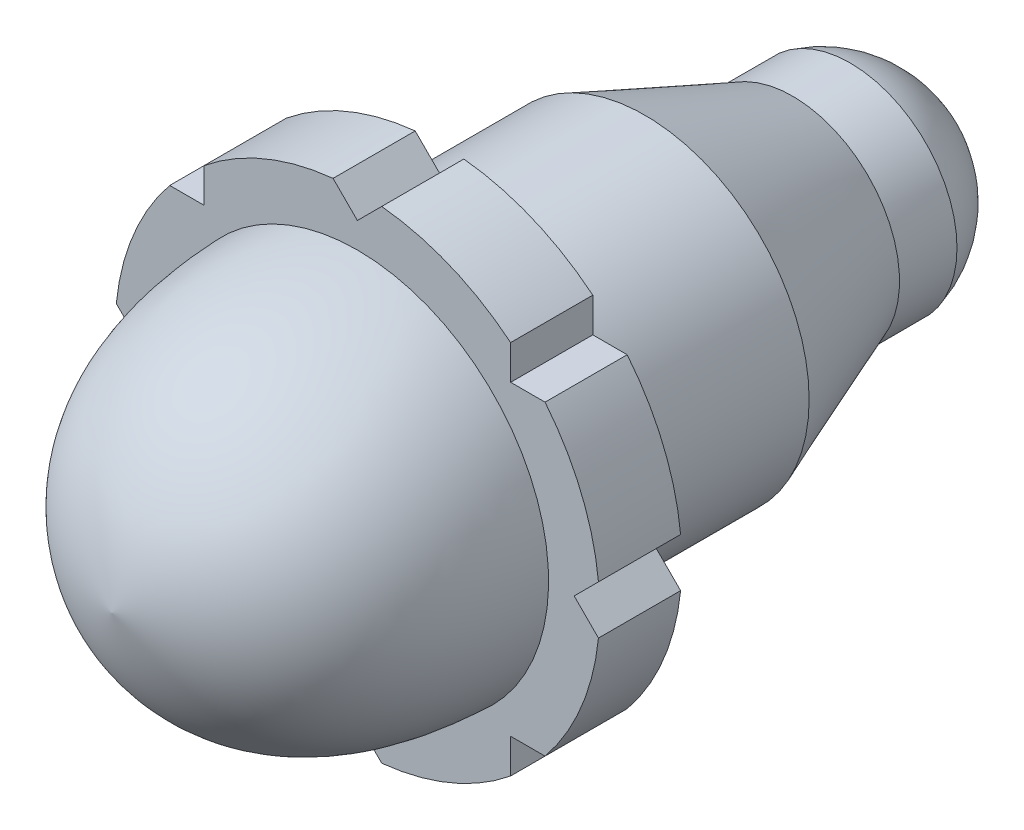
ISO-10303-21;
HEADER;
FILE_DESCRIPTION(('STEP AP214'),'2;1');
FILE_NAME('part.step','',(''),(''),'','','');
FILE_SCHEMA(('AUTOMOTIVE_DESIGN { 1 0 10303 214 1 1 1 1 }'));
ENDSEC;
DATA;
#1=APPLICATION_CONTEXT('core data for automotive mechanical design processes');
#2=APPLICATION_PROTOCOL_DEFINITION('international standard','automotive_design',2000,#1);
#3=PRODUCT_CONTEXT('',#1,'mechanical');
#4=PRODUCT('Part','Part','',(#3));
#5=PRODUCT_RELATED_PRODUCT_CATEGORY('part','',(#4));
#6=PRODUCT_DEFINITION_FORMATION('','',#4);
#7=PRODUCT_DEFINITION_CONTEXT('part definition',#1,'design');
#8=PRODUCT_DEFINITION('design','',#6,#7);
#9=PRODUCT_DEFINITION_SHAPE('','',#8);
#10=(LENGTH_UNIT() NAMED_UNIT(*) SI_UNIT(.MILLI.,.METRE.));
#11=(NAMED_UNIT(*) PLANE_ANGLE_UNIT() SI_UNIT($,.RADIAN.));
#12=(NAMED_UNIT(*) SI_UNIT($,.STERADIAN.) SOLID_ANGLE_UNIT());
#13=UNCERTAINTY_MEASURE_WITH_UNIT(LENGTH_MEASURE(1.E-05),#10,'distance_accuracy_value','');
#14=(GEOMETRIC_REPRESENTATION_CONTEXT(3) GLOBAL_UNCERTAINTY_ASSIGNED_CONTEXT((#13)) GLOBAL_UNIT_ASSIGNED_CONTEXT((#10,
#11,#12)) REPRESENTATION_CONTEXT('',''));
#15=CARTESIAN_POINT('',(0.,0.,0.));
#16=DIRECTION('',(0.,0.,1.));
#17=DIRECTION('',(1.,0.,0.));
#18=AXIS2_PLACEMENT_3D('',#15,#16,#17);
#19=CARTESIAN_POINT('',(0.,0.,12.712464268813));
#20=DIRECTION('',(0.,0.,1.));
#21=DIRECTION('',(1.,0.,0.));
#22=AXIS2_PLACEMENT_3D('',#19,#20,#21);
#23=CYLINDRICAL_SURFACE('',#22,7.493);
#24=CARTESIAN_POINT('',(0.,0.,0.));
#25=DIRECTION('',(0.,0.,1.));
#26=DIRECTION('',(1.,0.,0.));
#27=AXIS2_PLACEMENT_3D('',#24,#25,#26);
#28=CIRCLE('',#27,7.493);
#29=CARTESIAN_POINT('',(-7.45515396115093,-0.752149197656661,0.));
#30=VERTEX_POINT('',#29);
#31=CARTESIAN_POINT('',(-5.80343971884658,-4.73974012259258,0.));
#32=VERTEX_POINT('',#31);
#33=EDGE_CURVE('E466',#30,#32,#28,.T.);
#34=ORIENTED_EDGE('',*,*,#33,.F.);
#35=DIRECTION('',(0.,0.,1.));
#36=VECTOR('',#35,1.);
#37=CARTESIAN_POINT('',(-7.45515396115093,-0.752149197656661,-17.78));
#38=LINE('',#37,#36);
#39=CARTESIAN_POINT('',(-7.45515396115093,-0.752149197656661,-2.54));
#40=VERTEX_POINT('',#39);
#41=EDGE_CURVE('E283',#40,#30,#38,.T.);
#42=ORIENTED_EDGE('',*,*,#41,.F.);
#43=CARTESIAN_POINT('',(0.,0.,-2.54));
#44=DIRECTION('',(0.,0.,1.));
#45=DIRECTION('',(1.,0.,0.));
#46=AXIS2_PLACEMENT_3D('',#43,#44,#45);
#47=CIRCLE('',#46,7.493);
#48=CARTESIAN_POINT('',(-5.80343971884658,-4.73974012259258,-2.54));
#49=VERTEX_POINT('',#48);
#50=EDGE_CURVE('E525',#40,#49,#47,.T.);
#51=ORIENTED_EDGE('',*,*,#50,.T.);
#52=DIRECTION('',(0.,0.,1.));
#53=VECTOR('',#52,1.);
#54=CARTESIAN_POINT('',(-5.80343971884658,-4.73974012259258,-17.78));
#55=LINE('',#54,#53);
#56=EDGE_CURVE('E302',#49,#32,#55,.T.);
#57=ORIENTED_EDGE('',*,*,#56,.T.);
#58=EDGE_LOOP('',(#34,#42,#51,#57));
#59=FACE_BOUND('',#58,.T.);
#60=ADVANCED_FACE('F43',(#59),#23,.T.);
#61=CARTESIAN_POINT('',(-4.73974012259252,-5.80343971884663,0.));
#62=VERTEX_POINT('',#61);
#63=CARTESIAN_POINT('',(-0.752149197656635,-7.45515396115093,0.));
#64=VERTEX_POINT('',#63);
#65=EDGE_CURVE('E473',#62,#64,#28,.T.);
#66=ORIENTED_EDGE('',*,*,#65,.F.);
#67=DIRECTION('',(0.,0.,1.));
#68=VECTOR('',#67,1.);
#69=CARTESIAN_POINT('',(-4.73974012259252,-5.80343971884663,-17.78));
#70=LINE('',#69,#68);
#71=CARTESIAN_POINT('',(-4.73974012259252,-5.80343971884663,-2.54));
#72=VERTEX_POINT('',#71);
#73=EDGE_CURVE('E310',#72,#62,#70,.T.);
#74=ORIENTED_EDGE('',*,*,#73,.F.);
#75=CARTESIAN_POINT('',(-0.752149197656636,-7.45515396115093,-2.54));
#76=VERTEX_POINT('',#75);
#77=EDGE_CURVE('E530',#72,#76,#47,.T.);
#78=ORIENTED_EDGE('',*,*,#77,.T.);
#79=DIRECTION('',(0.,0.,1.));
#80=VECTOR('',#79,1.);
#81=CARTESIAN_POINT('',(-0.752149197656635,-7.45515396115093,-17.78));
#82=LINE('',#81,#80);
#83=EDGE_CURVE('E327',#76,#64,#82,.T.);
#84=ORIENTED_EDGE('',*,*,#83,.T.);
#85=EDGE_LOOP('',(#66,#74,#78,#84));
#86=FACE_BOUND('',#85,.T.);
#87=ADVANCED_FACE('F455',(#86),#23,.T.);
#88=CARTESIAN_POINT('',(0.752149197656635,-7.45515396115093,0.));
#89=VERTEX_POINT('',#88);
#90=CARTESIAN_POINT('',(4.7397401225926,-5.80343971884656,0.));
#91=VERTEX_POINT('',#90);
#92=EDGE_CURVE('E480',#89,#91,#28,.T.);
#93=ORIENTED_EDGE('',*,*,#92,.F.);
#94=DIRECTION('',(0.,0.,1.));
#95=VECTOR('',#94,1.);
#96=CARTESIAN_POINT('',(0.752149197656635,-7.45515396115093,-17.78));
#97=LINE('',#96,#95);
#98=CARTESIAN_POINT('',(0.752149197656635,-7.45515396115093,-2.54));
#99=VERTEX_POINT('',#98);
#100=EDGE_CURVE('E335',#99,#89,#97,.T.);
#101=ORIENTED_EDGE('',*,*,#100,.F.);
#102=CARTESIAN_POINT('',(4.7397401225926,-5.80343971884656,-2.54));
#103=VERTEX_POINT('',#102);
#104=EDGE_CURVE('E533',#99,#103,#47,.T.);
#105=ORIENTED_EDGE('',*,*,#104,.T.);
#106=DIRECTION('',(0.,0.,1.));
#107=VECTOR('',#106,1.);
#108=CARTESIAN_POINT('',(4.7397401225926,-5.80343971884656,-17.78));
#109=LINE('',#108,#107);
#110=EDGE_CURVE('E350',#103,#91,#109,.T.);
#111=ORIENTED_EDGE('',*,*,#110,.T.);
#112=EDGE_LOOP('',(#93,#101,#105,#111));
#113=FACE_BOUND('',#112,.T.);
#114=ADVANCED_FACE('F461',(#113),#23,.T.);
#115=CARTESIAN_POINT('',(5.80343971884665,-4.7397401225925,0.));
#116=VERTEX_POINT('',#115);
#117=CARTESIAN_POINT('',(7.45515396115094,-0.752149197656557,0.));
#118=VERTEX_POINT('',#117);
#119=EDGE_CURVE('E233',#116,#118,#28,.T.);
#120=ORIENTED_EDGE('',*,*,#119,.F.);
#121=DIRECTION('',(0.,0.,1.));
#122=VECTOR('',#121,1.);
#123=CARTESIAN_POINT('',(5.80343971884665,-4.7397401225925,-17.78));
#124=LINE('',#123,#122);
#125=CARTESIAN_POINT('',(5.80343971884665,-4.7397401225925,-2.54));
#126=VERTEX_POINT('',#125);
#127=EDGE_CURVE('E358',#126,#116,#124,.T.);
#128=ORIENTED_EDGE('',*,*,#127,.F.);
#129=CARTESIAN_POINT('',(7.45515396115094,-0.752149197656557,-2.54));
#130=VERTEX_POINT('',#129);
#131=EDGE_CURVE('E516',#126,#130,#47,.T.);
#132=ORIENTED_EDGE('',*,*,#131,.T.);
#133=DIRECTION('',(0.,0.,1.));
#134=VECTOR('',#133,1.);
#135=CARTESIAN_POINT('',(7.45515396115094,-0.752149197656557,-17.78));
#136=LINE('',#135,#134);
#137=EDGE_CURVE('E67',#130,#118,#136,.T.);
#138=ORIENTED_EDGE('',*,*,#137,.T.);
#139=EDGE_LOOP('',(#120,#128,#132,#138));
#140=FACE_BOUND('',#139,.T.);
#141=ADVANCED_FACE('F546',(#140),#23,.T.);
#142=CARTESIAN_POINT('',(7.45515396115093,0.752149197656713,0.));
#143=VERTEX_POINT('',#142);
#144=CARTESIAN_POINT('',(5.80343971884654,4.73974012259262,0.));
#145=VERTEX_POINT('',#144);
#146=EDGE_CURVE('E523',#143,#145,#28,.T.);
#147=ORIENTED_EDGE('',*,*,#146,.F.);
#148=DIRECTION('',(0.,0.,1.));
#149=VECTOR('',#148,1.);
#150=CARTESIAN_POINT('',(7.45515396115093,0.752149197656713,-17.78));
#151=LINE('',#150,#149);
#152=CARTESIAN_POINT('',(7.45515396115093,0.752149197656713,-2.54));
#153=VERTEX_POINT('',#152);
#154=EDGE_CURVE('E221',#153,#143,#151,.T.);
#155=ORIENTED_EDGE('',*,*,#154,.F.);
#156=CARTESIAN_POINT('',(5.80343971884655,4.73974012259262,-2.54));
#157=VERTEX_POINT('',#156);
#158=EDGE_CURVE('E511',#153,#157,#47,.T.);
#159=ORIENTED_EDGE('',*,*,#158,.T.);
#160=DIRECTION('',(0.,0.,1.));
#161=VECTOR('',#160,1.);
#162=CARTESIAN_POINT('',(5.80343971884654,4.73974012259262,-17.78));
#163=LINE('',#162,#161);
#164=EDGE_CURVE('E59',#157,#145,#163,.T.);
#165=ORIENTED_EDGE('',*,*,#164,.T.);
#166=EDGE_LOOP('',(#147,#155,#159,#165));
#167=FACE_BOUND('',#166,.T.);
#168=ADVANCED_FACE('F549',(#167),#23,.T.);
#169=CARTESIAN_POINT('',(4.73974012259248,5.80343971884666,0.));
#170=VERTEX_POINT('',#169);
#171=CARTESIAN_POINT('',(0.752149197656635,7.45515396115093,0.));
#172=VERTEX_POINT('',#171);
#173=EDGE_CURVE('E485',#170,#172,#28,.T.);
#174=ORIENTED_EDGE('',*,*,#173,.F.);
#175=DIRECTION('',(0.,0.,1.));
#176=VECTOR('',#175,1.);
#177=CARTESIAN_POINT('',(4.73974012259248,5.80343971884666,-17.78));
#178=LINE('',#177,#176);
#179=CARTESIAN_POINT('',(4.73974012259248,5.80343971884666,-2.54));
#180=VERTEX_POINT('',#179);
#181=EDGE_CURVE('E262',#180,#170,#178,.T.);
#182=ORIENTED_EDGE('',*,*,#181,.F.);
#183=CARTESIAN_POINT('',(0.752149197656636,7.45515396115093,-2.54));
#184=VERTEX_POINT('',#183);
#185=EDGE_CURVE('E493',#180,#184,#47,.T.);
#186=ORIENTED_EDGE('',*,*,#185,.T.);
#187=DIRECTION('',(0.,0.,1.));
#188=VECTOR('',#187,1.);
#189=CARTESIAN_POINT('',(0.752149197656635,7.45515396115093,-17.78));
#190=LINE('',#189,#188);
#191=EDGE_CURVE('E405',#184,#172,#190,.T.);
#192=ORIENTED_EDGE('',*,*,#191,.T.);
#193=EDGE_LOOP('',(#174,#182,#186,#192));
#194=FACE_BOUND('',#193,.T.);
#195=ADVANCED_FACE('F508',(#194),#23,.T.);
#196=CARTESIAN_POINT('',(-5.80343971884661,4.73974012259254,-2.54));
#197=VERTEX_POINT('',#196);
#198=CARTESIAN_POINT('',(-7.45515396115094,0.752149197656609,-2.54));
#199=VERTEX_POINT('',#198);
#200=EDGE_CURVE('E520',#197,#199,#47,.T.);
#201=ORIENTED_EDGE('',*,*,#200,.T.);
#202=DIRECTION('',(0.,0.,1.));
#203=VECTOR('',#202,1.);
#204=CARTESIAN_POINT('',(-7.45515396115094,0.752149197656609,-17.78));
#205=LINE('',#204,#203);
#206=CARTESIAN_POINT('',(-7.45515396115094,0.752149197656609,0.));
#207=VERTEX_POINT('',#206);
#208=EDGE_CURVE('E275',#199,#207,#205,.T.);
#209=ORIENTED_EDGE('',*,*,#208,.T.);
#210=CARTESIAN_POINT('',(-5.80343971884661,4.73974012259254,0.));
#211=VERTEX_POINT('',#210);
#212=EDGE_CURVE('E472',#211,#207,#28,.T.);
#213=ORIENTED_EDGE('',*,*,#212,.F.);
#214=DIRECTION('',(0.,0.,1.));
#215=VECTOR('',#214,1.);
#216=CARTESIAN_POINT('',(-5.80343971884661,4.73974012259254,-17.78));
#217=LINE('',#216,#215);
#218=EDGE_CURVE('E381',#197,#211,#217,.T.);
#219=ORIENTED_EDGE('',*,*,#218,.F.);
#220=EDGE_LOOP('',(#201,#209,#213,#219));
#221=FACE_BOUND('',#220,.T.);
#222=ADVANCED_FACE('F440',(#221),#23,.T.);
#223=CARTESIAN_POINT('',(0.,0.,12.712464268813));
#224=DIRECTION('',(0.,0.,1.));
#225=DIRECTION('',(1.,0.,0.));
#226=AXIS2_PLACEMENT_3D('',#223,#224,#225);
#227=CYLINDRICAL_SURFACE('',#226,5.08);
#228=CARTESIAN_POINT('',(0.,0.,-2.54));
#229=DIRECTION('',(0.,0.,1.));
#230=DIRECTION('',(1.,0.,0.));
#231=AXIS2_PLACEMENT_3D('',#228,#229,#230);
#232=CIRCLE('',#231,5.08);
#233=CARTESIAN_POINT('',(5.08,0.,-2.54));
#234=VERTEX_POINT('',#233);
#235=EDGE_CURVE('E512',#234,#234,#232,.T.);
#236=ORIENTED_EDGE('',*,*,#235,.F.);
#237=EDGE_LOOP('',(#236));
#238=FACE_BOUND('',#237,.T.);
#239=CARTESIAN_POINT('',(0.,0.,-8.89));
#240=DIRECTION('',(0.,0.,-1.));
#241=DIRECTION('',(-1.,0.,0.));
#242=AXIS2_PLACEMENT_3D('',#239,#240,#241);
#243=CIRCLE('',#242,5.08);
#244=CARTESIAN_POINT('',(-5.08,0.,-8.89));
#245=VERTEX_POINT('',#244);
#246=EDGE_CURVE('E411',#245,#245,#243,.T.);
#247=ORIENTED_EDGE('',*,*,#246,.F.);
#248=EDGE_LOOP('',(#247));
#249=FACE_BOUND('',#248,.T.);
#250=ADVANCED_FACE('F437',(#238,#249),#227,.T.);
#251=CARTESIAN_POINT('',(0.,0.,0.));
#252=DIRECTION('',(0.,0.,-1.));
#253=DIRECTION('',(-1.,0.,0.));
#254=AXIS2_PLACEMENT_3D('',#251,#252,#253);
#255=PLANE('',#254);
#256=CARTESIAN_POINT('',(0.,0.,0.));
#257=DIRECTION('',(0.,0.,-1.));
#258=DIRECTION('',(-1.,0.,0.));
#259=AXIS2_PLACEMENT_3D('',#256,#257,#258);
#260=CIRCLE('',#259,5.9130095269886);
#261=CARTESIAN_POINT('',(-5.9130095269886,0.,0.));
#262=VERTEX_POINT('',#261);
#263=EDGE_CURVE('E419',#262,#262,#260,.T.);
#264=ORIENTED_EDGE('',*,*,#263,.T.);
#265=EDGE_LOOP('',(#264));
#266=FACE_BOUND('',#265,.T.);
#267=DIRECTION('',(-0.707106781186549,0.707106781186546,0.));
#268=VECTOR('',#267,1.);
#269=CARTESIAN_POINT('',(-6.7030047634943,0.,0.));
#270=LINE('',#269,#268);
#271=CARTESIAN_POINT('',(-6.7030047634943,0.,0.));
#272=VERTEX_POINT('',#271);
#273=EDGE_CURVE('E268',#272,#207,#270,.T.);
#274=ORIENTED_EDGE('',*,*,#273,.F.);
#275=DIRECTION('',(0.707106781186544,0.707106781186551,0.));
#276=VECTOR('',#275,1.);
#277=CARTESIAN_POINT('',(-6.7030047634943,0.,0.));
#278=LINE('',#277,#276);
#279=EDGE_CURVE('E286',#30,#272,#278,.T.);
#280=ORIENTED_EDGE('',*,*,#279,.F.);
#281=ORIENTED_EDGE('',*,*,#33,.T.);
#282=DIRECTION('',(-1.,0.,0.));
#283=VECTOR('',#282,1.);
#284=CARTESIAN_POINT('',(-4.73974012259253,-4.73974012259258,0.));
#285=LINE('',#284,#283);
#286=CARTESIAN_POINT('',(-4.73974012259253,-4.73974012259258,0.));
#287=VERTEX_POINT('',#286);
#288=EDGE_CURVE('E295',#287,#32,#285,.T.);
#289=ORIENTED_EDGE('',*,*,#288,.F.);
#290=DIRECTION('',(0.,1.,0.));
#291=VECTOR('',#290,1.);
#292=CARTESIAN_POINT('',(-4.73974012259253,-4.73974012259258,0.));
#293=LINE('',#292,#291);
#294=EDGE_CURVE('E313',#62,#287,#293,.T.);
#295=ORIENTED_EDGE('',*,*,#294,.F.);
#296=ORIENTED_EDGE('',*,*,#65,.T.);
#297=DIRECTION('',(-0.707106781186548,-0.707106781186547,0.));
#298=VECTOR('',#297,1.);
#299=CARTESIAN_POINT('',(0.,-6.7030047634943,0.));
#300=LINE('',#299,#298);
#301=CARTESIAN_POINT('',(0.,-6.7030047634943,0.));
#302=VERTEX_POINT('',#301);
#303=EDGE_CURVE('E320',#302,#64,#300,.T.);
#304=ORIENTED_EDGE('',*,*,#303,.F.);
#305=DIRECTION('',(-0.707106781186548,0.707106781186547,0.));
#306=VECTOR('',#305,1.);
#307=CARTESIAN_POINT('',(0.,-6.7030047634943,0.));
#308=LINE('',#307,#306);
#309=EDGE_CURVE('E338',#89,#302,#308,.T.);
#310=ORIENTED_EDGE('',*,*,#309,.F.);
#311=ORIENTED_EDGE('',*,*,#92,.T.);
#312=DIRECTION('',(0.,-1.,0.));
#313=VECTOR('',#312,1.);
#314=CARTESIAN_POINT('',(4.73974012259259,-4.73974012259251,0.));
#315=LINE('',#314,#313);
#316=CARTESIAN_POINT('',(4.73974012259259,-4.73974012259251,0.));
#317=VERTEX_POINT('',#316);
#318=EDGE_CURVE('E250',#317,#91,#315,.T.);
#319=ORIENTED_EDGE('',*,*,#318,.F.);
#320=DIRECTION('',(-1.,0.,0.));
#321=VECTOR('',#320,1.);
#322=CARTESIAN_POINT('',(4.73974012259259,-4.73974012259251,0.));
#323=LINE('',#322,#321);
#324=EDGE_CURVE('E361',#116,#317,#323,.T.);
#325=ORIENTED_EDGE('',*,*,#324,.F.);
#326=ORIENTED_EDGE('',*,*,#119,.T.);
#327=DIRECTION('',(0.707106781186554,-0.707106781186541,0.));
#328=VECTOR('',#327,1.);
#329=CARTESIAN_POINT('',(6.7030047634943,0.,0.));
#330=LINE('',#329,#328);
#331=CARTESIAN_POINT('',(6.7030047634943,0.,0.));
#332=VERTEX_POINT('',#331);
#333=EDGE_CURVE('E211',#332,#118,#330,.T.);
#334=ORIENTED_EDGE('',*,*,#333,.F.);
#335=DIRECTION('',(-0.707106781186539,-0.707106781186556,0.));
#336=VECTOR('',#335,1.);
#337=CARTESIAN_POINT('',(6.7030047634943,0.,0.));
#338=LINE('',#337,#336);
#339=EDGE_CURVE('E218',#143,#332,#338,.T.);
#340=ORIENTED_EDGE('',*,*,#339,.F.);
#341=ORIENTED_EDGE('',*,*,#146,.T.);
#342=DIRECTION('',(1.,0.,0.));
#343=VECTOR('',#342,1.);
#344=CARTESIAN_POINT('',(4.73974012259249,4.73974012259261,0.));
#345=LINE('',#344,#343);
#346=CARTESIAN_POINT('',(4.73974012259249,4.73974012259261,0.));
#347=VERTEX_POINT('',#346);
#348=EDGE_CURVE('E251',#347,#145,#345,.T.);
#349=ORIENTED_EDGE('',*,*,#348,.F.);
#350=DIRECTION('',(0.,-1.,0.));
#351=VECTOR('',#350,1.);
#352=CARTESIAN_POINT('',(4.73974012259249,4.73974012259261,0.));
#353=LINE('',#352,#351);
#354=EDGE_CURVE('E239',#170,#347,#353,.T.);
#355=ORIENTED_EDGE('',*,*,#354,.F.);
#356=ORIENTED_EDGE('',*,*,#173,.T.);
#357=DIRECTION('',(0.707106781186548,0.707106781186547,0.));
#358=VECTOR('',#357,1.);
#359=CARTESIAN_POINT('',(0.,6.7030047634943,0.));
#360=LINE('',#359,#358);
#361=CARTESIAN_POINT('',(0.,6.7030047634943,0.));
#362=VERTEX_POINT('',#361);
#363=EDGE_CURVE('E396',#362,#172,#360,.T.);
#364=ORIENTED_EDGE('',*,*,#363,.F.);
#365=DIRECTION('',(0.707106781186548,-0.707106781186547,0.));
#366=VECTOR('',#365,1.);
#367=CARTESIAN_POINT('',(0.,6.7030047634943,0.));
#368=LINE('',#367,#366);
#369=CARTESIAN_POINT('',(-0.752149197656635,7.45515396115093,0.));
#370=VERTEX_POINT('',#369);
#371=EDGE_CURVE('E392',#370,#362,#368,.T.);
#372=ORIENTED_EDGE('',*,*,#371,.F.);
#373=CARTESIAN_POINT('',(-4.73974012259256,5.8034397188466,0.));
#374=VERTEX_POINT('',#373);
#375=EDGE_CURVE('E478',#370,#374,#28,.T.);
#376=ORIENTED_EDGE('',*,*,#375,.T.);
#377=DIRECTION('',(0.,1.,0.));
#378=VECTOR('',#377,1.);
#379=CARTESIAN_POINT('',(-4.73974012259256,4.73974012259254,0.));
#380=LINE('',#379,#378);
#381=CARTESIAN_POINT('',(-4.73974012259256,4.73974012259254,0.));
#382=VERTEX_POINT('',#381);
#383=EDGE_CURVE('E294',#382,#374,#380,.T.);
#384=ORIENTED_EDGE('',*,*,#383,.F.);
#385=DIRECTION('',(1.,0.,0.));
#386=VECTOR('',#385,1.);
#387=CARTESIAN_POINT('',(-4.73974012259256,4.73974012259254,0.));
#388=LINE('',#387,#386);
#389=EDGE_CURVE('E384',#211,#382,#388,.T.);
#390=ORIENTED_EDGE('',*,*,#389,.F.);
#391=ORIENTED_EDGE('',*,*,#212,.T.);
#392=EDGE_LOOP('',(#274,#280,#281,#289,#295,#296,#304,#310,#311,#319,#325,#326,#334,#340,#341,
#349,#355,#356,#364,#372,#376,#384,#390,#391));
#393=FACE_BOUND('',#392,.T.);
#394=ADVANCED_FACE('F230',(#266,#393),#255,.F.);
#395=CARTESIAN_POINT('',(-0.752149197656635,7.45515396115093,-2.54));
#396=VERTEX_POINT('',#395);
#397=CARTESIAN_POINT('',(-4.73974012259256,5.8034397188466,-2.54));
#398=VERTEX_POINT('',#397);
#399=EDGE_CURVE('E486',#396,#398,#47,.T.);
#400=ORIENTED_EDGE('',*,*,#399,.T.);
#401=DIRECTION('',(0.,0.,1.));
#402=VECTOR('',#401,1.);
#403=CARTESIAN_POINT('',(-4.73974012259256,5.8034397188466,-17.78));
#404=LINE('',#403,#402);
#405=EDGE_CURVE('E373',#398,#374,#404,.T.);
#406=ORIENTED_EDGE('',*,*,#405,.T.);
#407=ORIENTED_EDGE('',*,*,#375,.F.);
#408=DIRECTION('',(0.,0.,1.));
#409=VECTOR('',#408,1.);
#410=CARTESIAN_POINT('',(-0.752149197656635,7.45515396115093,-17.78));
#411=LINE('',#410,#409);
#412=EDGE_CURVE('E401',#396,#370,#411,.T.);
#413=ORIENTED_EDGE('',*,*,#412,.F.);
#414=EDGE_LOOP('',(#400,#406,#407,#413));
#415=FACE_BOUND('',#414,.T.);
#416=ADVANCED_FACE('F444',(#415),#23,.T.);
#417=CARTESIAN_POINT('',(0.,7.493,-2.54));
#418=DIRECTION('',(0.,0.,1.));
#419=DIRECTION('',(1.,0.,0.));
#420=AXIS2_PLACEMENT_3D('',#417,#418,#419);
#421=PLANE('',#420);
#422=ORIENTED_EDGE('',*,*,#50,.F.);
#423=DIRECTION('',(0.707106781186544,0.707106781186551,0.));
#424=VECTOR('',#423,1.);
#425=CARTESIAN_POINT('',(-7.09800238174715,-0.394997618252874,-2.54));
#426=LINE('',#425,#424);
#427=CARTESIAN_POINT('',(-6.7030047634943,0.,-2.54));
#428=VERTEX_POINT('',#427);
#429=EDGE_CURVE('E290',#40,#428,#426,.T.);
#430=ORIENTED_EDGE('',*,*,#429,.T.);
#431=DIRECTION('',(-0.707106781186549,0.707106781186546,0.));
#432=VECTOR('',#431,1.);
#433=CARTESIAN_POINT('',(-7.09800238174715,0.394997618252825,-2.54));
#434=LINE('',#433,#432);
#435=EDGE_CURVE('E279',#428,#199,#434,.T.);
#436=ORIENTED_EDGE('',*,*,#435,.T.);
#437=ORIENTED_EDGE('',*,*,#200,.F.);
#438=DIRECTION('',(1.,0.,0.));
#439=VECTOR('',#438,1.);
#440=CARTESIAN_POINT('',(-5.29835111143081,4.73974012259254,-2.54));
#441=LINE('',#440,#439);
#442=CARTESIAN_POINT('',(-4.73974012259256,4.73974012259254,-2.54));
#443=VERTEX_POINT('',#442);
#444=EDGE_CURVE('E388',#197,#443,#441,.T.);
#445=ORIENTED_EDGE('',*,*,#444,.T.);
#446=DIRECTION('',(0.,1.,0.));
#447=VECTOR('',#446,1.);
#448=CARTESIAN_POINT('',(-4.73974012259256,5.29835111143079,-2.54));
#449=LINE('',#448,#447);
#450=EDGE_CURVE('E377',#443,#398,#449,.T.);
#451=ORIENTED_EDGE('',*,*,#450,.T.);
#452=ORIENTED_EDGE('',*,*,#399,.F.);
#453=DIRECTION('',(0.707106781186548,-0.707106781186547,0.));
#454=VECTOR('',#453,1.);
#455=CARTESIAN_POINT('',(-0.394997618252849,7.09800238174715,-2.54));
#456=LINE('',#455,#454);
#457=CARTESIAN_POINT('',(0.,6.7030047634943,-2.54));
#458=VERTEX_POINT('',#457);
#459=EDGE_CURVE('E11',#396,#458,#456,.T.);
#460=ORIENTED_EDGE('',*,*,#459,.T.);
#461=DIRECTION('',(0.707106781186548,0.707106781186547,0.));
#462=VECTOR('',#461,1.);
#463=CARTESIAN_POINT('',(0.394997618252849,7.09800238174715,-2.54));
#464=LINE('',#463,#462);
#465=EDGE_CURVE('E52',#458,#184,#464,.T.);
#466=ORIENTED_EDGE('',*,*,#465,.T.);
#467=ORIENTED_EDGE('',*,*,#185,.F.);
#468=DIRECTION('',(0.,-1.,0.));
#469=VECTOR('',#468,1.);
#470=CARTESIAN_POINT('',(4.73974012259248,5.29835111143086,-2.54));
#471=LINE('',#470,#469);
#472=CARTESIAN_POINT('',(4.73974012259249,4.73974012259261,-2.54));
#473=VERTEX_POINT('',#472);
#474=EDGE_CURVE('E235',#180,#473,#471,.T.);
#475=ORIENTED_EDGE('',*,*,#474,.T.);
#476=DIRECTION('',(1.,0.,0.));
#477=VECTOR('',#476,1.);
#478=CARTESIAN_POINT('',(5.29835111143074,4.73974012259261,-2.54));
#479=LINE('',#478,#477);
#480=EDGE_CURVE('E259',#473,#157,#479,.T.);
#481=ORIENTED_EDGE('',*,*,#480,.T.);
#482=ORIENTED_EDGE('',*,*,#158,.F.);
#483=DIRECTION('',(-0.707106781186539,-0.707106781186556,0.));
#484=VECTOR('',#483,1.);
#485=CARTESIAN_POINT('',(7.09800238174715,0.394997618252924,-2.54));
#486=LINE('',#485,#484);
#487=CARTESIAN_POINT('',(6.7030047634943,0.,-2.54));
#488=VERTEX_POINT('',#487);
#489=EDGE_CURVE('E226',#153,#488,#486,.T.);
#490=ORIENTED_EDGE('',*,*,#489,.T.);
#491=DIRECTION('',(0.707106781186554,-0.707106781186541,0.));
#492=VECTOR('',#491,1.);
#493=CARTESIAN_POINT('',(7.09800238174715,-0.394997618252775,-2.54));
#494=LINE('',#493,#492);
#495=EDGE_CURVE('E212',#488,#130,#494,.T.);
#496=ORIENTED_EDGE('',*,*,#495,.T.);
#497=ORIENTED_EDGE('',*,*,#131,.F.);
#498=DIRECTION('',(-1.,0.,0.));
#499=VECTOR('',#498,1.);
#500=CARTESIAN_POINT('',(5.29835111143084,-4.7397401225925,-2.54));
#501=LINE('',#500,#499);
#502=CARTESIAN_POINT('',(4.73974012259259,-4.73974012259251,-2.54));
#503=VERTEX_POINT('',#502);
#504=EDGE_CURVE('E324',#126,#503,#501,.T.);
#505=ORIENTED_EDGE('',*,*,#504,.T.);
#506=DIRECTION('',(0.,-1.,0.));
#507=VECTOR('',#506,1.);
#508=CARTESIAN_POINT('',(4.7397401225926,-5.29835111143076,-2.54));
#509=LINE('',#508,#507);
#510=EDGE_CURVE('E354',#503,#103,#509,.T.);
#511=ORIENTED_EDGE('',*,*,#510,.T.);
#512=ORIENTED_EDGE('',*,*,#104,.F.);
#513=DIRECTION('',(-0.707106781186548,0.707106781186547,0.));
#514=VECTOR('',#513,1.);
#515=CARTESIAN_POINT('',(0.394997618252849,-7.09800238174715,-2.54));
#516=LINE('',#515,#514);
#517=CARTESIAN_POINT('',(0.,-6.7030047634943,-2.54));
#518=VERTEX_POINT('',#517);
#519=EDGE_CURVE('E299',#99,#518,#516,.T.);
#520=ORIENTED_EDGE('',*,*,#519,.T.);
#521=DIRECTION('',(-0.707106781186548,-0.707106781186547,0.));
#522=VECTOR('',#521,1.);
#523=CARTESIAN_POINT('',(-0.394997618252849,-7.09800238174715,-2.54));
#524=LINE('',#523,#522);
#525=EDGE_CURVE('E331',#518,#76,#524,.T.);
#526=ORIENTED_EDGE('',*,*,#525,.T.);
#527=ORIENTED_EDGE('',*,*,#77,.F.);
#528=DIRECTION('',(0.,1.,0.));
#529=VECTOR('',#528,1.);
#530=CARTESIAN_POINT('',(-4.73974012259252,-5.29835111143082,-2.54));
#531=LINE('',#530,#529);
#532=CARTESIAN_POINT('',(-4.73974012259253,-4.73974012259258,-2.54));
#533=VERTEX_POINT('',#532);
#534=EDGE_CURVE('E272',#72,#533,#531,.T.);
#535=ORIENTED_EDGE('',*,*,#534,.T.);
#536=DIRECTION('',(-1.,0.,0.));
#537=VECTOR('',#536,1.);
#538=CARTESIAN_POINT('',(-5.29835111143078,-4.73974012259258,-2.54));
#539=LINE('',#538,#537);
#540=EDGE_CURVE('E306',#533,#49,#539,.T.);
#541=ORIENTED_EDGE('',*,*,#540,.T.);
#542=EDGE_LOOP('',(#422,#430,#436,#437,#445,#451,#452,#460,#466,#467,#475,#481,#482,#490,#496,
#497,#505,#511,#512,#520,#526,#527,#535,#541));
#543=FACE_BOUND('',#542,.T.);
#544=ORIENTED_EDGE('',*,*,#235,.T.);
#545=EDGE_LOOP('',(#544));
#546=FACE_BOUND('',#545,.T.);
#547=ADVANCED_FACE('F434',(#543,#546),#421,.F.);
#548=CARTESIAN_POINT('',(0.,5.9130095269886,0.));
#549=CARTESIAN_POINT('',(0.,5.68254374252135,6.69843498796636));
#550=CARTESIAN_POINT('',(0.,0.,7.59707569872001));
#551=B_SPLINE_CURVE_WITH_KNOTS('',2,(#548,#549,#550),.UNSPECIFIED.,.F.,.F.,(3,3),(0.,1.),.UNSPECIFIED.);
#552=CARTESIAN_POINT('',(0.,0.,-15.24));
#553=DIRECTION('',(0.,0.,-1.));
#554=AXIS1_PLACEMENT('',#552,#553);
#555=SURFACE_OF_REVOLUTION('',#551,#554);
#556=CARTESIAN_POINT('',(0.,0.,7.59707569872001));
#557=VERTEX_POINT('',#556);
#558=VERTEX_LOOP('',#557);
#559=FACE_BOUND('',#558,.T.);
#560=ORIENTED_EDGE('',*,*,#263,.F.);
#561=EDGE_LOOP('',(#560));
#562=FACE_BOUND('',#561,.T.);
#563=ADVANCED_FACE('F429',(#559,#562),#555,.F.);
#564=CARTESIAN_POINT('',(0.,0.,-15.3387109425088));
#565=DIRECTION('',(0.,0.,-1.));
#566=DIRECTION('',(-1.,0.,0.));
#567=AXIS2_PLACEMENT_3D('',#564,#565,#566);
#568=CYLINDRICAL_SURFACE('',#567,3.302);
#569=CARTESIAN_POINT('',(0.,0.,-15.24));
#570=DIRECTION('',(0.,0.,-1.));
#571=DIRECTION('',(-1.,0.,0.));
#572=AXIS2_PLACEMENT_3D('',#569,#570,#571);
#573=CIRCLE('',#572,3.302);
#574=CARTESIAN_POINT('',(-3.302,0.,-15.24));
#575=VERTEX_POINT('',#574);
#576=EDGE_CURVE('E404',#575,#575,#573,.T.);
#577=ORIENTED_EDGE('',*,*,#576,.F.);
#578=EDGE_LOOP('',(#577));
#579=FACE_BOUND('',#578,.T.);
#580=CARTESIAN_POINT('',(0.,0.,-13.462));
#581=DIRECTION('',(0.,0.,-1.));
#582=DIRECTION('',(-1.,0.,0.));
#583=AXIS2_PLACEMENT_3D('',#580,#581,#582);
#584=CIRCLE('',#583,3.302);
#585=CARTESIAN_POINT('',(-3.302,0.,-13.462));
#586=VERTEX_POINT('',#585);
#587=EDGE_CURVE('E415',#586,#586,#584,.T.);
#588=ORIENTED_EDGE('',*,*,#587,.T.);
#589=EDGE_LOOP('',(#588));
#590=FACE_BOUND('',#589,.T.);
#591=ADVANCED_FACE('F433',(#579,#590),#568,.T.);
#592=CARTESIAN_POINT('',(0.,0.,-8.89));
#593=DIRECTION('',(0.,0.,1.));
#594=DIRECTION('',(1.,0.,0.));
#595=AXIS2_PLACEMENT_3D('',#592,#593,#594);
#596=CONICAL_SURFACE('',#595,5.08,0.370891288812663);
#597=ORIENTED_EDGE('',*,*,#587,.F.);
#598=EDGE_LOOP('',(#597));
#599=FACE_BOUND('',#598,.T.);
#600=ORIENTED_EDGE('',*,*,#246,.T.);
#601=EDGE_LOOP('',(#600));
#602=FACE_BOUND('',#601,.T.);
#603=ADVANCED_FACE('F609',(#599,#602),#596,.T.);
#604=CARTESIAN_POINT('',(0.,0.,-14.3637));
#605=DIRECTION('',(0.,0.,1.));
#606=DIRECTION('',(1.,0.,0.));
#607=AXIS2_PLACEMENT_3D('',#604,#605,#606);
#608=SPHERICAL_SURFACE('',#607,3.4163);
#609=ORIENTED_EDGE('',*,*,#576,.T.);
#610=EDGE_LOOP('',(#609));
#611=FACE_BOUND('',#610,.T.);
#612=ADVANCED_FACE('F45',(#611),#608,.T.);
#613=CARTESIAN_POINT('',(0.,6.7030047634943,-17.78));
#614=DIRECTION('',(-0.707106781186547,-0.707106781186548,0.));
#615=DIRECTION('',(0.707106781186548,-0.707106781186547,0.));
#616=AXIS2_PLACEMENT_3D('',#613,#614,#615);
#617=PLANE('',#616);
#618=ORIENTED_EDGE('',*,*,#412,.T.);
#619=ORIENTED_EDGE('',*,*,#371,.T.);
#620=DIRECTION('',(0.,0.,1.));
#621=VECTOR('',#620,1.);
#622=CARTESIAN_POINT('',(0.,6.7030047634943,-17.78));
#623=LINE('',#622,#621);
#624=EDGE_CURVE('E400',#458,#362,#623,.T.);
#625=ORIENTED_EDGE('',*,*,#624,.F.);
#626=ORIENTED_EDGE('',*,*,#459,.F.);
#627=EDGE_LOOP('',(#618,#619,#625,#626));
#628=FACE_BOUND('',#627,.T.);
#629=ADVANCED_FACE('F500',(#628),#617,.F.);
#630=CARTESIAN_POINT('',(0.,6.7030047634943,-17.78));
#631=DIRECTION('',(0.707106781186547,-0.707106781186548,0.));
#632=DIRECTION('',(0.707106781186548,0.707106781186547,0.));
#633=AXIS2_PLACEMENT_3D('',#630,#631,#632);
#634=PLANE('',#633);
#635=ORIENTED_EDGE('',*,*,#624,.T.);
#636=ORIENTED_EDGE('',*,*,#363,.T.);
#637=ORIENTED_EDGE('',*,*,#191,.F.);
#638=ORIENTED_EDGE('',*,*,#465,.F.);
#639=EDGE_LOOP('',(#635,#636,#637,#638));
#640=FACE_BOUND('',#639,.T.);
#641=ADVANCED_FACE('F498',(#640),#634,.F.);
#642=CARTESIAN_POINT('',(-4.73974012259256,4.73974012259254,-17.78));
#643=DIRECTION('',(0.,-1.,0.));
#644=DIRECTION('',(1.,0.,0.));
#645=AXIS2_PLACEMENT_3D('',#642,#643,#644);
#646=PLANE('',#645);
#647=ORIENTED_EDGE('',*,*,#218,.T.);
#648=ORIENTED_EDGE('',*,*,#389,.T.);
#649=DIRECTION('',(0.,0.,1.));
#650=VECTOR('',#649,1.);
#651=CARTESIAN_POINT('',(-4.73974012259256,4.73974012259254,-17.78));
#652=LINE('',#651,#650);
#653=EDGE_CURVE('E370',#443,#382,#652,.T.);
#654=ORIENTED_EDGE('',*,*,#653,.F.);
#655=ORIENTED_EDGE('',*,*,#444,.F.);
#656=EDGE_LOOP('',(#647,#648,#654,#655));
#657=FACE_BOUND('',#656,.T.);
#658=ADVANCED_FACE('F601',(#657),#646,.F.);
#659=CARTESIAN_POINT('',(-4.73974012259256,4.73974012259254,-17.78));
#660=DIRECTION('',(1.,0.,0.));
#661=DIRECTION('',(0.,1.,0.));
#662=AXIS2_PLACEMENT_3D('',#659,#660,#661);
#663=PLANE('',#662);
#664=ORIENTED_EDGE('',*,*,#653,.T.);
#665=ORIENTED_EDGE('',*,*,#383,.T.);
#666=ORIENTED_EDGE('',*,*,#405,.F.);
#667=ORIENTED_EDGE('',*,*,#450,.F.);
#668=EDGE_LOOP('',(#664,#665,#666,#667));
#669=FACE_BOUND('',#668,.T.);
#670=ADVANCED_FACE('F597',(#669),#663,.F.);
#671=CARTESIAN_POINT('',(4.73974012259249,4.73974012259261,-17.78));
#672=DIRECTION('',(-1.,0.,0.));
#673=DIRECTION('',(0.,-1.,0.));
#674=AXIS2_PLACEMENT_3D('',#671,#672,#673);
#675=PLANE('',#674);
#676=ORIENTED_EDGE('',*,*,#181,.T.);
#677=ORIENTED_EDGE('',*,*,#354,.T.);
#678=DIRECTION('',(0.,0.,1.));
#679=VECTOR('',#678,1.);
#680=CARTESIAN_POINT('',(4.73974012259249,4.73974012259261,-17.78));
#681=LINE('',#680,#679);
#682=EDGE_CURVE('E254',#473,#347,#681,.T.);
#683=ORIENTED_EDGE('',*,*,#682,.F.);
#684=ORIENTED_EDGE('',*,*,#474,.F.);
#685=EDGE_LOOP('',(#676,#677,#683,#684));
#686=FACE_BOUND('',#685,.T.);
#687=ADVANCED_FACE('F600',(#686),#675,.F.);
#688=CARTESIAN_POINT('',(4.73974012259249,4.73974012259261,-17.78));
#689=DIRECTION('',(0.,-1.,0.));
#690=DIRECTION('',(1.,0.,0.));
#691=AXIS2_PLACEMENT_3D('',#688,#689,#690);
#692=PLANE('',#691);
#693=ORIENTED_EDGE('',*,*,#682,.T.);
#694=ORIENTED_EDGE('',*,*,#348,.T.);
#695=ORIENTED_EDGE('',*,*,#164,.F.);
#696=ORIENTED_EDGE('',*,*,#480,.F.);
#697=EDGE_LOOP('',(#693,#694,#695,#696));
#698=FACE_BOUND('',#697,.T.);
#699=ADVANCED_FACE('F737',(#698),#692,.F.);
#700=CARTESIAN_POINT('',(6.7030047634943,0.,-17.78));
#701=DIRECTION('',(-0.707106781186556,0.707106781186539,0.));
#702=DIRECTION('',(-0.707106781186539,-0.707106781186556,0.));
#703=AXIS2_PLACEMENT_3D('',#700,#701,#702);
#704=PLANE('',#703);
#705=ORIENTED_EDGE('',*,*,#154,.T.);
#706=ORIENTED_EDGE('',*,*,#339,.T.);
#707=DIRECTION('',(0.,0.,1.));
#708=VECTOR('',#707,1.);
#709=CARTESIAN_POINT('',(6.7030047634943,0.,-17.78));
#710=LINE('',#709,#708);
#711=EDGE_CURVE('E207',#488,#332,#710,.T.);
#712=ORIENTED_EDGE('',*,*,#711,.F.);
#713=ORIENTED_EDGE('',*,*,#489,.F.);
#714=EDGE_LOOP('',(#705,#706,#712,#713));
#715=FACE_BOUND('',#714,.T.);
#716=ADVANCED_FACE('F219',(#715),#704,.F.);
#717=CARTESIAN_POINT('',(6.7030047634943,0.,-17.78));
#718=DIRECTION('',(-0.707106781186541,-0.707106781186554,0.));
#719=DIRECTION('',(0.707106781186554,-0.707106781186541,0.));
#720=AXIS2_PLACEMENT_3D('',#717,#718,#719);
#721=PLANE('',#720);
#722=ORIENTED_EDGE('',*,*,#711,.T.);
#723=ORIENTED_EDGE('',*,*,#333,.T.);
#724=ORIENTED_EDGE('',*,*,#137,.F.);
#725=ORIENTED_EDGE('',*,*,#495,.F.);
#726=EDGE_LOOP('',(#722,#723,#724,#725));
#727=FACE_BOUND('',#726,.T.);
#728=ADVANCED_FACE('F209',(#727),#721,.F.);
#729=CARTESIAN_POINT('',(4.73974012259259,-4.73974012259251,-17.78));
#730=DIRECTION('',(0.,1.,0.));
#731=DIRECTION('',(-1.,0.,0.));
#732=AXIS2_PLACEMENT_3D('',#729,#730,#731);
#733=PLANE('',#732);
#734=ORIENTED_EDGE('',*,*,#127,.T.);
#735=ORIENTED_EDGE('',*,*,#324,.T.);
#736=DIRECTION('',(0.,0.,1.));
#737=VECTOR('',#736,1.);
#738=CARTESIAN_POINT('',(4.73974012259259,-4.73974012259251,-17.78));
#739=LINE('',#738,#737);
#740=EDGE_CURVE('E347',#503,#317,#739,.T.);
#741=ORIENTED_EDGE('',*,*,#740,.F.);
#742=ORIENTED_EDGE('',*,*,#504,.F.);
#743=EDGE_LOOP('',(#734,#735,#741,#742));
#744=FACE_BOUND('',#743,.T.);
#745=ADVANCED_FACE('F593',(#744),#733,.F.);
#746=CARTESIAN_POINT('',(4.73974012259259,-4.73974012259251,-17.78));
#747=DIRECTION('',(-1.,0.,0.));
#748=DIRECTION('',(0.,-1.,0.));
#749=AXIS2_PLACEMENT_3D('',#746,#747,#748);
#750=PLANE('',#749);
#751=ORIENTED_EDGE('',*,*,#740,.T.);
#752=ORIENTED_EDGE('',*,*,#318,.T.);
#753=ORIENTED_EDGE('',*,*,#110,.F.);
#754=ORIENTED_EDGE('',*,*,#510,.F.);
#755=EDGE_LOOP('',(#751,#752,#753,#754));
#756=FACE_BOUND('',#755,.T.);
#757=ADVANCED_FACE('F561',(#756),#750,.F.);
#758=CARTESIAN_POINT('',(0.,-6.7030047634943,-17.78));
#759=DIRECTION('',(0.707106781186547,0.707106781186548,0.));
#760=DIRECTION('',(-0.707106781186548,0.707106781186547,0.));
#761=AXIS2_PLACEMENT_3D('',#758,#759,#760);
#762=PLANE('',#761);
#763=ORIENTED_EDGE('',*,*,#100,.T.);
#764=ORIENTED_EDGE('',*,*,#309,.T.);
#765=DIRECTION('',(0.,0.,1.));
#766=VECTOR('',#765,1.);
#767=CARTESIAN_POINT('',(0.,-6.7030047634943,-17.78));
#768=LINE('',#767,#766);
#769=EDGE_CURVE('E323',#518,#302,#768,.T.);
#770=ORIENTED_EDGE('',*,*,#769,.F.);
#771=ORIENTED_EDGE('',*,*,#519,.F.);
#772=EDGE_LOOP('',(#763,#764,#770,#771));
#773=FACE_BOUND('',#772,.T.);
#774=ADVANCED_FACE('F564',(#773),#762,.F.);
#775=CARTESIAN_POINT('',(0.,-6.7030047634943,-17.78));
#776=DIRECTION('',(-0.707106781186547,0.707106781186548,0.));
#777=DIRECTION('',(-0.707106781186548,-0.707106781186547,0.));
#778=AXIS2_PLACEMENT_3D('',#775,#776,#777);
#779=PLANE('',#778);
#780=ORIENTED_EDGE('',*,*,#769,.T.);
#781=ORIENTED_EDGE('',*,*,#303,.T.);
#782=ORIENTED_EDGE('',*,*,#83,.F.);
#783=ORIENTED_EDGE('',*,*,#525,.F.);
#784=EDGE_LOOP('',(#780,#781,#782,#783));
#785=FACE_BOUND('',#784,.T.);
#786=ADVANCED_FACE('F566',(#785),#779,.F.);
#787=CARTESIAN_POINT('',(-4.73974012259253,-4.73974012259258,-17.78));
#788=DIRECTION('',(1.,0.,0.));
#789=DIRECTION('',(0.,1.,0.));
#790=AXIS2_PLACEMENT_3D('',#787,#788,#789);
#791=PLANE('',#790);
#792=ORIENTED_EDGE('',*,*,#73,.T.);
#793=ORIENTED_EDGE('',*,*,#294,.T.);
#794=DIRECTION('',(0.,0.,1.));
#795=VECTOR('',#794,1.);
#796=CARTESIAN_POINT('',(-4.73974012259253,-4.73974012259258,-17.78));
#797=LINE('',#796,#795);
#798=EDGE_CURVE('E298',#533,#287,#797,.T.);
#799=ORIENTED_EDGE('',*,*,#798,.F.);
#800=ORIENTED_EDGE('',*,*,#534,.F.);
#801=EDGE_LOOP('',(#792,#793,#799,#800));
#802=FACE_BOUND('',#801,.T.);
#803=ADVANCED_FACE('F570',(#802),#791,.F.);
#804=CARTESIAN_POINT('',(-4.73974012259253,-4.73974012259258,-17.78));
#805=DIRECTION('',(0.,1.,0.));
#806=DIRECTION('',(-1.,0.,0.));
#807=AXIS2_PLACEMENT_3D('',#804,#805,#806);
#808=PLANE('',#807);
#809=ORIENTED_EDGE('',*,*,#798,.T.);
#810=ORIENTED_EDGE('',*,*,#288,.T.);
#811=ORIENTED_EDGE('',*,*,#56,.F.);
#812=ORIENTED_EDGE('',*,*,#540,.F.);
#813=EDGE_LOOP('',(#809,#810,#811,#812));
#814=FACE_BOUND('',#813,.T.);
#815=ADVANCED_FACE('F573',(#814),#808,.F.);
#816=CARTESIAN_POINT('',(-6.7030047634943,0.,-17.78));
#817=DIRECTION('',(0.707106781186551,-0.707106781186544,0.));
#818=DIRECTION('',(0.707106781186544,0.707106781186551,0.));
#819=AXIS2_PLACEMENT_3D('',#816,#817,#818);
#820=PLANE('',#819);
#821=ORIENTED_EDGE('',*,*,#41,.T.);
#822=ORIENTED_EDGE('',*,*,#279,.T.);
#823=DIRECTION('',(0.,0.,1.));
#824=VECTOR('',#823,1.);
#825=CARTESIAN_POINT('',(-6.7030047634943,0.,-17.78));
#826=LINE('',#825,#824);
#827=EDGE_CURVE('E271',#428,#272,#826,.T.);
#828=ORIENTED_EDGE('',*,*,#827,.F.);
#829=ORIENTED_EDGE('',*,*,#429,.F.);
#830=EDGE_LOOP('',(#821,#822,#828,#829));
#831=FACE_BOUND('',#830,.T.);
#832=ADVANCED_FACE('F575',(#831),#820,.F.);
#833=CARTESIAN_POINT('',(-6.7030047634943,0.,-17.78));
#834=DIRECTION('',(0.707106781186546,0.707106781186549,0.));
#835=DIRECTION('',(-0.707106781186549,0.707106781186546,0.));
#836=AXIS2_PLACEMENT_3D('',#833,#834,#835);
#837=PLANE('',#836);
#838=ORIENTED_EDGE('',*,*,#827,.T.);
#839=ORIENTED_EDGE('',*,*,#273,.T.);
#840=ORIENTED_EDGE('',*,*,#208,.F.);
#841=ORIENTED_EDGE('',*,*,#435,.F.);
#842=EDGE_LOOP('',(#838,#839,#840,#841));
#843=FACE_BOUND('',#842,.T.);
#844=ADVANCED_FACE('F581',(#843),#837,.F.);
#845=CLOSED_SHELL('',(#60,#87,#114,#141,#168,#195,#222,#250,#394,#416,#547,#563,#591,#603,#612,
#629,#641,#658,#670,#687,#699,#716,#728,#745,#757,#774,#786,#803,#815,#832,#844));
#846=MANIFOLD_SOLID_BREP('B2',#845);
#847=ADVANCED_BREP_SHAPE_REPRESENTATION('',(#18,#846),#14);
#848=SHAPE_DEFINITION_REPRESENTATION(#9,#847);
ENDSEC;
END-ISO-10303-21;
